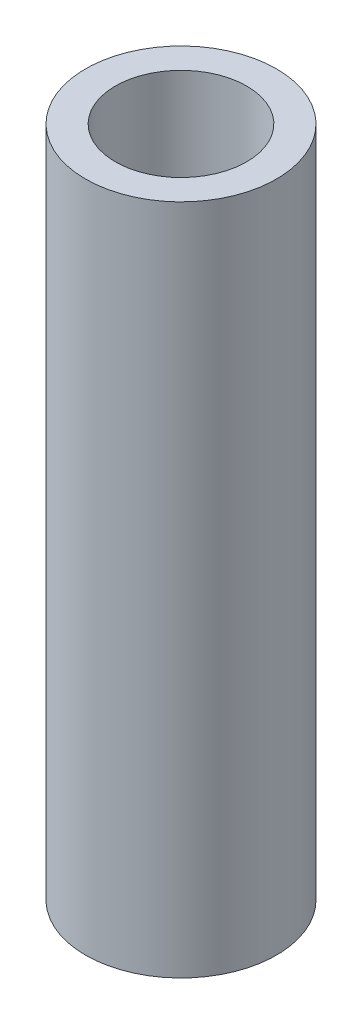
ISO-10303-21;
HEADER;
FILE_DESCRIPTION(('STEP AP214'),'2;1');
FILE_NAME('part.step','',(''),(''),'','','');
FILE_SCHEMA(('AUTOMOTIVE_DESIGN { 1 0 10303 214 1 1 1 1 }'));
ENDSEC;
DATA;
#1=APPLICATION_CONTEXT('core data for automotive mechanical design processes');
#2=APPLICATION_PROTOCOL_DEFINITION('international standard','automotive_design',2000,#1);
#3=PRODUCT_CONTEXT('',#1,'mechanical');
#4=PRODUCT('Part','Part','',(#3));
#5=PRODUCT_RELATED_PRODUCT_CATEGORY('part','',(#4));
#6=PRODUCT_DEFINITION_FORMATION('','',#4);
#7=PRODUCT_DEFINITION_CONTEXT('part definition',#1,'design');
#8=PRODUCT_DEFINITION('design','',#6,#7);
#9=PRODUCT_DEFINITION_SHAPE('','',#8);
#10=(LENGTH_UNIT() NAMED_UNIT(*) SI_UNIT(.MILLI.,.METRE.));
#11=(NAMED_UNIT(*) PLANE_ANGLE_UNIT() SI_UNIT($,.RADIAN.));
#12=(NAMED_UNIT(*) SI_UNIT($,.STERADIAN.) SOLID_ANGLE_UNIT());
#13=UNCERTAINTY_MEASURE_WITH_UNIT(LENGTH_MEASURE(1.E-05),#10,'distance_accuracy_value','');
#14=(GEOMETRIC_REPRESENTATION_CONTEXT(3) GLOBAL_UNCERTAINTY_ASSIGNED_CONTEXT((#13)) GLOBAL_UNIT_ASSIGNED_CONTEXT((#10,
#11,#12)) REPRESENTATION_CONTEXT('',''));
#15=CARTESIAN_POINT('',(0.,0.,0.));
#16=DIRECTION('',(0.,0.,1.));
#17=DIRECTION('',(1.,0.,0.));
#18=AXIS2_PLACEMENT_3D('',#15,#16,#17);
#19=CARTESIAN_POINT('',(0.,27.94,0.));
#20=DIRECTION('',(0.,-1.,0.));
#21=DIRECTION('',(0.,0.,-1.));
#22=AXIS2_PLACEMENT_3D('',#19,#20,#21);
#23=CYLINDRICAL_SURFACE('',#22,2.7305);
#24=CARTESIAN_POINT('',(0.,0.,0.));
#25=DIRECTION('',(0.,-1.,0.));
#26=DIRECTION('',(0.,0.,-1.));
#27=AXIS2_PLACEMENT_3D('',#24,#25,#26);
#28=CIRCLE('',#27,2.7305);
#29=CARTESIAN_POINT('',(0.,0.,-2.7305));
#30=VERTEX_POINT('',#29);
#31=EDGE_CURVE('E27',#30,#30,#28,.T.);
#32=ORIENTED_EDGE('',*,*,#31,.T.);
#33=EDGE_LOOP('',(#32));
#34=FACE_BOUND('',#33,.T.);
#35=CARTESIAN_POINT('',(0.,27.94,0.));
#36=DIRECTION('',(0.,-1.,0.));
#37=DIRECTION('',(0.,0.,-1.));
#38=AXIS2_PLACEMENT_3D('',#35,#36,#37);
#39=CIRCLE('',#38,2.7305);
#40=CARTESIAN_POINT('',(0.,27.94,-2.7305));
#41=VERTEX_POINT('',#40);
#42=EDGE_CURVE('E18',#41,#41,#39,.T.);
#43=ORIENTED_EDGE('',*,*,#42,.F.);
#44=EDGE_LOOP('',(#43));
#45=FACE_BOUND('',#44,.T.);
#46=ADVANCED_FACE('F15',(#34,#45),#23,.F.);
#47=CARTESIAN_POINT('',(0.,27.94,0.));
#48=DIRECTION('',(0.,1.,0.));
#49=DIRECTION('',(0.,0.,1.));
#50=AXIS2_PLACEMENT_3D('',#47,#48,#49);
#51=PLANE('',#50);
#52=ORIENTED_EDGE('',*,*,#42,.T.);
#53=EDGE_LOOP('',(#52));
#54=FACE_BOUND('',#53,.T.);
#55=CARTESIAN_POINT('',(0.,27.94,0.));
#56=DIRECTION('',(0.,-1.,0.));
#57=DIRECTION('',(0.,0.,-1.));
#58=AXIS2_PLACEMENT_3D('',#55,#56,#57);
#59=CIRCLE('',#58,3.96875);
#60=CARTESIAN_POINT('',(0.,27.94,-3.96875));
#61=VERTEX_POINT('',#60);
#62=EDGE_CURVE('E22',#61,#61,#59,.T.);
#63=ORIENTED_EDGE('',*,*,#62,.F.);
#64=EDGE_LOOP('',(#63));
#65=FACE_BOUND('',#64,.T.);
#66=ADVANCED_FACE('F35',(#54,#65),#51,.T.);
#67=CARTESIAN_POINT('',(0.,0.,0.));
#68=DIRECTION('',(0.,1.,0.));
#69=DIRECTION('',(0.,0.,1.));
#70=AXIS2_PLACEMENT_3D('',#67,#68,#69);
#71=PLANE('',#70);
#72=ORIENTED_EDGE('',*,*,#31,.F.);
#73=EDGE_LOOP('',(#72));
#74=FACE_BOUND('',#73,.T.);
#75=CARTESIAN_POINT('',(0.,0.,0.));
#76=DIRECTION('',(0.,-1.,0.));
#77=DIRECTION('',(0.,0.,-1.));
#78=AXIS2_PLACEMENT_3D('',#75,#76,#77);
#79=CIRCLE('',#78,3.96875);
#80=CARTESIAN_POINT('',(0.,0.,-3.96875));
#81=VERTEX_POINT('',#80);
#82=EDGE_CURVE('E10',#81,#81,#79,.F.);
#83=ORIENTED_EDGE('',*,*,#82,.F.);
#84=EDGE_LOOP('',(#83));
#85=FACE_BOUND('',#84,.T.);
#86=ADVANCED_FACE('F43',(#74,#85),#71,.F.);
#87=CARTESIAN_POINT('',(0.,27.94,0.));
#88=DIRECTION('',(0.,-1.,0.));
#89=DIRECTION('',(0.,0.,-1.));
#90=AXIS2_PLACEMENT_3D('',#87,#88,#89);
#91=CYLINDRICAL_SURFACE('',#90,3.96875);
#92=ORIENTED_EDGE('',*,*,#82,.T.);
#93=EDGE_LOOP('',(#92));
#94=FACE_BOUND('',#93,.T.);
#95=ORIENTED_EDGE('',*,*,#62,.T.);
#96=EDGE_LOOP('',(#95));
#97=FACE_BOUND('',#96,.T.);
#98=ADVANCED_FACE('F44',(#94,#97),#91,.T.);
#99=CLOSED_SHELL('',(#46,#66,#86,#98));
#100=MANIFOLD_SOLID_BREP('B1',#99);
#101=ADVANCED_BREP_SHAPE_REPRESENTATION('',(#18,#100),#14);
#102=SHAPE_DEFINITION_REPRESENTATION(#9,#101);
ENDSEC;
END-ISO-10303-21;
